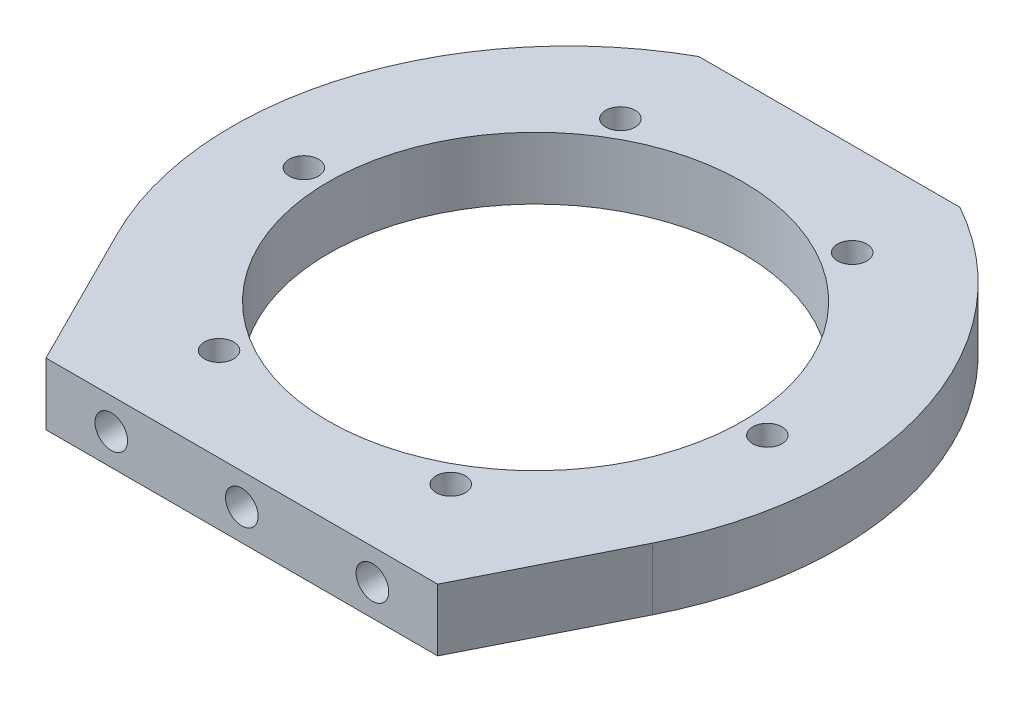
ISO-10303-21;
HEADER;
FILE_DESCRIPTION(('STEP AP214'),'2;1');
FILE_NAME('part.step','',(''),(''),'','','');
FILE_SCHEMA(('AUTOMOTIVE_DESIGN { 1 0 10303 214 1 1 1 1 }'));
ENDSEC;
DATA;
#1=APPLICATION_CONTEXT('core data for automotive mechanical design processes');
#2=APPLICATION_PROTOCOL_DEFINITION('international standard','automotive_design',2000,#1);
#3=PRODUCT_CONTEXT('',#1,'mechanical');
#4=PRODUCT('Part','Part','',(#3));
#5=PRODUCT_RELATED_PRODUCT_CATEGORY('part','',(#4));
#6=PRODUCT_DEFINITION_FORMATION('','',#4);
#7=PRODUCT_DEFINITION_CONTEXT('part definition',#1,'design');
#8=PRODUCT_DEFINITION('design','',#6,#7);
#9=PRODUCT_DEFINITION_SHAPE('','',#8);
#10=(LENGTH_UNIT() NAMED_UNIT(*) SI_UNIT(.MILLI.,.METRE.));
#11=(NAMED_UNIT(*) PLANE_ANGLE_UNIT() SI_UNIT($,.RADIAN.));
#12=(NAMED_UNIT(*) SI_UNIT($,.STERADIAN.) SOLID_ANGLE_UNIT());
#13=UNCERTAINTY_MEASURE_WITH_UNIT(LENGTH_MEASURE(1.E-05),#10,'distance_accuracy_value','');
#14=(GEOMETRIC_REPRESENTATION_CONTEXT(3) GLOBAL_UNCERTAINTY_ASSIGNED_CONTEXT((#13)) GLOBAL_UNIT_ASSIGNED_CONTEXT((#10,
#11,#12)) REPRESENTATION_CONTEXT('',''));
#15=CARTESIAN_POINT('',(0.,0.,0.));
#16=DIRECTION('',(0.,0.,1.));
#17=DIRECTION('',(1.,0.,0.));
#18=AXIS2_PLACEMENT_3D('',#15,#16,#17);
#19=CARTESIAN_POINT('',(-40.9977972178871,4.7625,23.1128243860878));
#20=DIRECTION('',(0.893540202746201,0.,-0.448983191307066));
#21=DIRECTION('',(-0.448983191307066,0.,-0.893540202746202));
#22=AXIS2_PLACEMENT_3D('',#19,#20,#21);
#23=PLANE('',#22);
#24=DIRECTION('',(0.448983191307066,0.,0.893540202746201));
#25=VECTOR('',#24,1.);
#26=CARTESIAN_POINT('',(-40.9977972178871,-4.7625,23.1128243860878));
#27=LINE('',#26,#25);
#28=CARTESIAN_POINT('',(-40.9977972178872,-4.7625,23.1128243860878));
#29=VERTEX_POINT('',#28);
#30=CARTESIAN_POINT('',(-30.,-4.7625,45.));
#31=VERTEX_POINT('',#30);
#32=EDGE_CURVE('E116',#29,#31,#27,.T.);
#33=ORIENTED_EDGE('',*,*,#32,.T.);
#34=DIRECTION('',(0.,-1.,0.));
#35=VECTOR('',#34,1.);
#36=CARTESIAN_POINT('',(-30.,4.7625,45.));
#37=LINE('',#36,#35);
#38=CARTESIAN_POINT('',(-30.,4.7625,45.));
#39=VERTEX_POINT('',#38);
#40=EDGE_CURVE('E11',#39,#31,#37,.T.);
#41=ORIENTED_EDGE('',*,*,#40,.F.);
#42=DIRECTION('',(0.448983191307066,0.,0.893540202746201));
#43=VECTOR('',#42,1.);
#44=CARTESIAN_POINT('',(-40.9977972178871,4.7625,23.1128243860878));
#45=LINE('',#44,#43);
#46=CARTESIAN_POINT('',(-40.9977972178872,4.7625,23.1128243860878));
#47=VERTEX_POINT('',#46);
#48=EDGE_CURVE('E127',#47,#39,#45,.T.);
#49=ORIENTED_EDGE('',*,*,#48,.F.);
#50=DIRECTION('',(0.,-1.,0.));
#51=VECTOR('',#50,1.);
#52=CARTESIAN_POINT('',(-40.9977972178872,4.7625,23.1128243860878));
#53=LINE('',#52,#51);
#54=EDGE_CURVE('E112',#47,#29,#53,.T.);
#55=ORIENTED_EDGE('',*,*,#54,.T.);
#56=EDGE_LOOP('',(#33,#41,#49,#55));
#57=FACE_BOUND('',#56,.T.);
#58=ADVANCED_FACE('F32',(#57),#23,.F.);
#59=CARTESIAN_POINT('',(-30.,4.7625,45.));
#60=DIRECTION('',(0.,0.,-1.));
#61=DIRECTION('',(-1.,0.,0.));
#62=AXIS2_PLACEMENT_3D('',#59,#60,#61);
#63=PLANE('',#62);
#64=CARTESIAN_POINT('',(-20.,0.,45.));
#65=DIRECTION('',(0.,0.,1.));
#66=DIRECTION('',(1.,0.,0.));
#67=AXIS2_PLACEMENT_3D('',#64,#65,#66);
#68=CIRCLE('',#67,2.5);
#69=CARTESIAN_POINT('',(-17.5,0.,45.));
#70=VERTEX_POINT('',#69);
#71=EDGE_CURVE('E405',#70,#70,#68,.T.);
#72=ORIENTED_EDGE('',*,*,#71,.F.);
#73=EDGE_LOOP('',(#72));
#74=FACE_BOUND('',#73,.T.);
#75=CARTESIAN_POINT('',(20.,0.,45.));
#76=DIRECTION('',(0.,0.,1.));
#77=DIRECTION('',(-1.,0.,0.));
#78=AXIS2_PLACEMENT_3D('',#75,#76,#77);
#79=CIRCLE('',#78,2.5);
#80=CARTESIAN_POINT('',(17.5,0.,45.));
#81=VERTEX_POINT('',#80);
#82=EDGE_CURVE('E399',#81,#81,#79,.T.);
#83=ORIENTED_EDGE('',*,*,#82,.F.);
#84=EDGE_LOOP('',(#83));
#85=FACE_BOUND('',#84,.T.);
#86=CARTESIAN_POINT('',(0.,0.,45.));
#87=DIRECTION('',(0.,0.,1.));
#88=DIRECTION('',(1.,0.,0.));
#89=AXIS2_PLACEMENT_3D('',#86,#87,#88);
#90=CIRCLE('',#89,2.5);
#91=CARTESIAN_POINT('',(2.5,0.,45.));
#92=VERTEX_POINT('',#91);
#93=EDGE_CURVE('E393',#92,#92,#90,.T.);
#94=ORIENTED_EDGE('',*,*,#93,.F.);
#95=EDGE_LOOP('',(#94));
#96=FACE_BOUND('',#95,.T.);
#97=DIRECTION('',(1.,0.,0.));
#98=VECTOR('',#97,1.);
#99=CARTESIAN_POINT('',(-30.,-4.7625,45.));
#100=LINE('',#99,#98);
#101=CARTESIAN_POINT('',(30.,-4.7625,45.));
#102=VERTEX_POINT('',#101);
#103=EDGE_CURVE('E119',#31,#102,#100,.T.);
#104=ORIENTED_EDGE('',*,*,#103,.T.);
#105=DIRECTION('',(0.,-1.,0.));
#106=VECTOR('',#105,1.);
#107=CARTESIAN_POINT('',(30.,4.7625,45.));
#108=LINE('',#107,#106);
#109=CARTESIAN_POINT('',(30.,4.7625,45.));
#110=VERTEX_POINT('',#109);
#111=EDGE_CURVE('E40',#110,#102,#108,.T.);
#112=ORIENTED_EDGE('',*,*,#111,.F.);
#113=DIRECTION('',(1.,0.,0.));
#114=VECTOR('',#113,1.);
#115=CARTESIAN_POINT('',(-30.,4.7625,45.));
#116=LINE('',#115,#114);
#117=EDGE_CURVE('E85',#39,#110,#116,.T.);
#118=ORIENTED_EDGE('',*,*,#117,.F.);
#119=ORIENTED_EDGE('',*,*,#40,.T.);
#120=EDGE_LOOP('',(#104,#112,#118,#119));
#121=FACE_BOUND('',#120,.T.);
#122=ADVANCED_FACE('F153',(#74,#85,#96,#121),#63,.F.);
#123=CARTESIAN_POINT('',(40.9977972178871,4.7625,23.1128243860878));
#124=DIRECTION('',(-0.893540202746202,0.,-0.448983191307065));
#125=DIRECTION('',(-0.448983191307065,0.,0.893540202746202));
#126=AXIS2_PLACEMENT_3D('',#123,#124,#125);
#127=PLANE('',#126);
#128=DIRECTION('',(0.448983191307065,0.,-0.893540202746202));
#129=VECTOR('',#128,1.);
#130=CARTESIAN_POINT('',(40.9977972178871,-4.7625,23.1128243860878));
#131=LINE('',#130,#129);
#132=CARTESIAN_POINT('',(40.9977972178871,-4.7625,23.1128243860878));
#133=VERTEX_POINT('',#132);
#134=EDGE_CURVE('E122',#102,#133,#131,.T.);
#135=ORIENTED_EDGE('',*,*,#134,.T.);
#136=DIRECTION('',(0.,-1.,0.));
#137=VECTOR('',#136,1.);
#138=CARTESIAN_POINT('',(40.9977972178871,4.7625,23.1128243860878));
#139=LINE('',#138,#137);
#140=CARTESIAN_POINT('',(40.9977972178871,4.7625,23.1128243860878));
#141=VERTEX_POINT('',#140);
#142=EDGE_CURVE('E107',#141,#133,#139,.T.);
#143=ORIENTED_EDGE('',*,*,#142,.F.);
#144=DIRECTION('',(0.448983191307065,0.,-0.893540202746202));
#145=VECTOR('',#144,1.);
#146=CARTESIAN_POINT('',(40.9977972178871,4.7625,23.1128243860878));
#147=LINE('',#146,#145);
#148=EDGE_CURVE('E98',#110,#141,#147,.T.);
#149=ORIENTED_EDGE('',*,*,#148,.F.);
#150=ORIENTED_EDGE('',*,*,#111,.T.);
#151=EDGE_LOOP('',(#135,#143,#149,#150));
#152=FACE_BOUND('',#151,.T.);
#153=ADVANCED_FACE('F133',(#152),#127,.F.);
#154=CARTESIAN_POINT('',(-5.,4.7625,0.));
#155=DIRECTION('',(0.,-1.,0.));
#156=DIRECTION('',(0.,0.,-1.));
#157=AXIS2_PLACEMENT_3D('',#154,#155,#156);
#158=CYLINDRICAL_SURFACE('',#157,51.478150704935);
#159=CARTESIAN_POINT('',(-5.,-4.7625,0.));
#160=DIRECTION('',(0.,1.,0.));
#161=DIRECTION('',(0.,0.,-1.));
#162=AXIS2_PLACEMENT_3D('',#159,#160,#161);
#163=CIRCLE('',#162,51.478150704935);
#164=CARTESIAN_POINT('',(20.,-4.7625,-45.));
#165=VERTEX_POINT('',#164);
#166=EDGE_CURVE('E106',#133,#165,#163,.T.);
#167=ORIENTED_EDGE('',*,*,#166,.T.);
#168=DIRECTION('',(0.,-1.,0.));
#169=VECTOR('',#168,1.);
#170=CARTESIAN_POINT('',(20.,4.7625,-45.));
#171=LINE('',#170,#169);
#172=CARTESIAN_POINT('',(20.,4.7625,-45.));
#173=VERTEX_POINT('',#172);
#174=EDGE_CURVE('E103',#173,#165,#171,.T.);
#175=ORIENTED_EDGE('',*,*,#174,.F.);
#176=CARTESIAN_POINT('',(-5.,4.7625,0.));
#177=DIRECTION('',(0.,1.,0.));
#178=DIRECTION('',(0.,0.,-1.));
#179=AXIS2_PLACEMENT_3D('',#176,#177,#178);
#180=CIRCLE('',#179,51.478150704935);
#181=EDGE_CURVE('E92',#141,#173,#180,.T.);
#182=ORIENTED_EDGE('',*,*,#181,.F.);
#183=ORIENTED_EDGE('',*,*,#142,.T.);
#184=EDGE_LOOP('',(#167,#175,#182,#183));
#185=FACE_BOUND('',#184,.T.);
#186=ADVANCED_FACE('F104',(#185),#158,.T.);
#187=CARTESIAN_POINT('',(-20.,4.7625,-45.));
#188=DIRECTION('',(0.,0.,1.));
#189=DIRECTION('',(1.,0.,0.));
#190=AXIS2_PLACEMENT_3D('',#187,#188,#189);
#191=PLANE('',#190);
#192=CARTESIAN_POINT('',(12.,0.,-45.));
#193=DIRECTION('',(0.,0.,-1.));
#194=DIRECTION('',(-1.,0.,0.));
#195=AXIS2_PLACEMENT_3D('',#192,#193,#194);
#196=CIRCLE('',#195,2.5);
#197=CARTESIAN_POINT('',(9.50000000000001,0.,-45.));
#198=VERTEX_POINT('',#197);
#199=EDGE_CURVE('E388',#198,#198,#196,.T.);
#200=ORIENTED_EDGE('',*,*,#199,.F.);
#201=EDGE_LOOP('',(#200));
#202=FACE_BOUND('',#201,.T.);
#203=CARTESIAN_POINT('',(-12.,0.,-45.));
#204=DIRECTION('',(0.,0.,-1.));
#205=DIRECTION('',(1.,0.,0.));
#206=AXIS2_PLACEMENT_3D('',#203,#204,#205);
#207=CIRCLE('',#206,2.5);
#208=CARTESIAN_POINT('',(-9.49999999999999,0.,-45.));
#209=VERTEX_POINT('',#208);
#210=EDGE_CURVE('E381',#209,#209,#207,.T.);
#211=ORIENTED_EDGE('',*,*,#210,.F.);
#212=EDGE_LOOP('',(#211));
#213=FACE_BOUND('',#212,.T.);
#214=DIRECTION('',(-1.,0.,0.));
#215=VECTOR('',#214,1.);
#216=CARTESIAN_POINT('',(-20.,-4.7625,-45.));
#217=LINE('',#216,#215);
#218=CARTESIAN_POINT('',(-20.,-4.7625,-45.));
#219=VERTEX_POINT('',#218);
#220=EDGE_CURVE('E71',#165,#219,#217,.T.);
#221=ORIENTED_EDGE('',*,*,#220,.T.);
#222=DIRECTION('',(0.,-1.,0.));
#223=VECTOR('',#222,1.);
#224=CARTESIAN_POINT('',(-20.,4.7625,-45.));
#225=LINE('',#224,#223);
#226=CARTESIAN_POINT('',(-20.,4.7625,-45.));
#227=VERTEX_POINT('',#226);
#228=EDGE_CURVE('E108',#227,#219,#225,.T.);
#229=ORIENTED_EDGE('',*,*,#228,.F.);
#230=DIRECTION('',(-1.,0.,0.));
#231=VECTOR('',#230,1.);
#232=CARTESIAN_POINT('',(-20.,4.7625,-45.));
#233=LINE('',#232,#231);
#234=EDGE_CURVE('E96',#173,#227,#233,.T.);
#235=ORIENTED_EDGE('',*,*,#234,.F.);
#236=ORIENTED_EDGE('',*,*,#174,.T.);
#237=EDGE_LOOP('',(#221,#229,#235,#236));
#238=FACE_BOUND('',#237,.T.);
#239=ADVANCED_FACE('F110',(#202,#213,#238),#191,.F.);
#240=CARTESIAN_POINT('',(5.,4.7625,0.));
#241=DIRECTION('',(0.,-1.,0.));
#242=DIRECTION('',(0.,0.,-1.));
#243=AXIS2_PLACEMENT_3D('',#240,#241,#242);
#244=CYLINDRICAL_SURFACE('',#243,51.478150704935);
#245=CARTESIAN_POINT('',(5.,-4.7625,0.));
#246=DIRECTION('',(0.,1.,0.));
#247=DIRECTION('',(0.,0.,1.));
#248=AXIS2_PLACEMENT_3D('',#245,#246,#247);
#249=CIRCLE('',#248,51.478150704935);
#250=EDGE_CURVE('E77',#219,#29,#249,.T.);
#251=ORIENTED_EDGE('',*,*,#250,.T.);
#252=ORIENTED_EDGE('',*,*,#54,.F.);
#253=CARTESIAN_POINT('',(5.,4.7625,0.));
#254=DIRECTION('',(0.,1.,0.));
#255=DIRECTION('',(0.,0.,1.));
#256=AXIS2_PLACEMENT_3D('',#253,#254,#255);
#257=CIRCLE('',#256,51.478150704935);
#258=EDGE_CURVE('E48',#227,#47,#257,.T.);
#259=ORIENTED_EDGE('',*,*,#258,.F.);
#260=ORIENTED_EDGE('',*,*,#228,.T.);
#261=EDGE_LOOP('',(#251,#252,#259,#260));
#262=FACE_BOUND('',#261,.T.);
#263=ADVANCED_FACE('F140',(#262),#244,.T.);
#264=CARTESIAN_POINT('',(-5.,4.7625,0.));
#265=DIRECTION('',(0.,-1.,0.));
#266=DIRECTION('',(0.,0.,-1.));
#267=AXIS2_PLACEMENT_3D('',#264,#265,#266);
#268=PLANE('',#267);
#269=CARTESIAN_POINT('',(-17.7499999999993,4.7625,-30.7439018343462));
#270=DIRECTION('',(0.,1.,0.));
#271=DIRECTION('',(0.,0.,1.));
#272=AXIS2_PLACEMENT_3D('',#269,#270,#271);
#273=CIRCLE('',#272,2.25);
#274=CARTESIAN_POINT('',(-17.7499999999993,4.7625,-28.4939018343462));
#275=VERTEX_POINT('',#274);
#276=EDGE_CURVE('E362',#275,#275,#273,.T.);
#277=ORIENTED_EDGE('',*,*,#276,.F.);
#278=EDGE_LOOP('',(#277));
#279=FACE_BOUND('',#278,.T.);
#280=CARTESIAN_POINT('',(-35.4999999999977,4.7625,1.41206490944512E-12));
#281=DIRECTION('',(0.,1.,0.));
#282=DIRECTION('',(0.,0.,1.));
#283=AXIS2_PLACEMENT_3D('',#280,#281,#282);
#284=CIRCLE('',#283,2.25);
#285=CARTESIAN_POINT('',(-35.4999999999977,4.7625,2.25000000000141));
#286=VERTEX_POINT('',#285);
#287=EDGE_CURVE('E361',#286,#286,#284,.T.);
#288=ORIENTED_EDGE('',*,*,#287,.F.);
#289=EDGE_LOOP('',(#288));
#290=FACE_BOUND('',#289,.T.);
#291=CARTESIAN_POINT('',(-17.7499999999969,4.7625,30.7439018343476));
#292=DIRECTION('',(0.,1.,0.));
#293=DIRECTION('',(0.,0.,1.));
#294=AXIS2_PLACEMENT_3D('',#291,#292,#293);
#295=CIRCLE('',#294,2.25);
#296=CARTESIAN_POINT('',(-17.7499999999969,4.7625,32.9939018343476));
#297=VERTEX_POINT('',#296);
#298=EDGE_CURVE('E367',#297,#297,#295,.T.);
#299=ORIENTED_EDGE('',*,*,#298,.F.);
#300=EDGE_LOOP('',(#299));
#301=FACE_BOUND('',#300,.T.);
#302=CARTESIAN_POINT('',(17.7500000000023,4.7625,30.7439018343462));
#303=DIRECTION('',(0.,1.,0.));
#304=DIRECTION('',(0.,0.,1.));
#305=AXIS2_PLACEMENT_3D('',#302,#303,#304);
#306=CIRCLE('',#305,2.25);
#307=CARTESIAN_POINT('',(17.7500000000023,4.7625,32.9939018343462));
#308=VERTEX_POINT('',#307);
#309=EDGE_CURVE('E371',#308,#308,#306,.T.);
#310=ORIENTED_EDGE('',*,*,#309,.F.);
#311=EDGE_LOOP('',(#310));
#312=FACE_BOUND('',#311,.T.);
#313=CARTESIAN_POINT('',(35.5000000000007,4.7625,-1.40859546249317E-12));
#314=DIRECTION('',(0.,1.,0.));
#315=DIRECTION('',(0.,0.,1.));
#316=AXIS2_PLACEMENT_3D('',#313,#314,#315);
#317=CIRCLE('',#316,2.25);
#318=CARTESIAN_POINT('',(35.5000000000007,4.7625,2.24999999999859));
#319=VERTEX_POINT('',#318);
#320=EDGE_CURVE('E375',#319,#319,#317,.T.);
#321=ORIENTED_EDGE('',*,*,#320,.F.);
#322=EDGE_LOOP('',(#321));
#323=FACE_BOUND('',#322,.T.);
#324=CARTESIAN_POINT('',(17.7499999999999,4.7625,-30.7439018343476));
#325=DIRECTION('',(0.,1.,0.));
#326=DIRECTION('',(0.,0.,1.));
#327=AXIS2_PLACEMENT_3D('',#324,#325,#326);
#328=CIRCLE('',#327,2.25);
#329=CARTESIAN_POINT('',(17.7499999999999,4.7625,-28.4939018343476));
#330=VERTEX_POINT('',#329);
#331=EDGE_CURVE('E357',#330,#330,#328,.T.);
#332=ORIENTED_EDGE('',*,*,#331,.F.);
#333=EDGE_LOOP('',(#332));
#334=FACE_BOUND('',#333,.T.);
#335=CARTESIAN_POINT('',(0.,4.7625,0.));
#336=DIRECTION('',(0.,1.,0.));
#337=DIRECTION('',(0.,0.,1.));
#338=AXIS2_PLACEMENT_3D('',#335,#336,#337);
#339=CIRCLE('',#338,31.75);
#340=CARTESIAN_POINT('',(0.,4.7625,31.75));
#341=VERTEX_POINT('',#340);
#342=EDGE_CURVE('E349',#341,#341,#339,.T.);
#343=ORIENTED_EDGE('',*,*,#342,.F.);
#344=EDGE_LOOP('',(#343));
#345=FACE_BOUND('',#344,.T.);
#346=ORIENTED_EDGE('',*,*,#48,.T.);
#347=ORIENTED_EDGE('',*,*,#117,.T.);
#348=ORIENTED_EDGE('',*,*,#148,.T.);
#349=ORIENTED_EDGE('',*,*,#181,.T.);
#350=ORIENTED_EDGE('',*,*,#234,.T.);
#351=ORIENTED_EDGE('',*,*,#258,.T.);
#352=EDGE_LOOP('',(#346,#347,#348,#349,#350,#351));
#353=FACE_BOUND('',#352,.T.);
#354=ADVANCED_FACE('F94',(#279,#290,#301,#312,#323,#334,#345,#353),#268,.F.);
#355=CARTESIAN_POINT('',(-5.,-4.7625,0.));
#356=DIRECTION('',(0.,-1.,0.));
#357=DIRECTION('',(0.,0.,-1.));
#358=AXIS2_PLACEMENT_3D('',#355,#356,#357);
#359=PLANE('',#358);
#360=CARTESIAN_POINT('',(-17.7499999999993,-4.7625,-30.7439018343462));
#361=DIRECTION('',(0.,-1.,0.));
#362=DIRECTION('',(0.,0.,-1.));
#363=AXIS2_PLACEMENT_3D('',#360,#361,#362);
#364=CIRCLE('',#363,2.25);
#365=CARTESIAN_POINT('',(-17.7499999999993,-4.7625,-32.9939018343462));
#366=VERTEX_POINT('',#365);
#367=EDGE_CURVE('E325',#366,#366,#364,.F.);
#368=ORIENTED_EDGE('',*,*,#367,.T.);
#369=EDGE_LOOP('',(#368));
#370=FACE_BOUND('',#369,.T.);
#371=CARTESIAN_POINT('',(-35.4999999999977,-4.7625,1.41206490944512E-12));
#372=DIRECTION('',(0.,-1.,0.));
#373=DIRECTION('',(0.,0.,-1.));
#374=AXIS2_PLACEMENT_3D('',#371,#372,#373);
#375=CIRCLE('',#374,2.25);
#376=CARTESIAN_POINT('',(-35.4999999999977,-4.7625,-2.24999999999859));
#377=VERTEX_POINT('',#376);
#378=EDGE_CURVE('E329',#377,#377,#375,.F.);
#379=ORIENTED_EDGE('',*,*,#378,.T.);
#380=EDGE_LOOP('',(#379));
#381=FACE_BOUND('',#380,.T.);
#382=CARTESIAN_POINT('',(-17.7499999999969,-4.7625,30.7439018343476));
#383=DIRECTION('',(0.,-1.,0.));
#384=DIRECTION('',(0.,0.,-1.));
#385=AXIS2_PLACEMENT_3D('',#382,#383,#384);
#386=CIRCLE('',#385,2.25);
#387=CARTESIAN_POINT('',(-17.7499999999969,-4.7625,28.4939018343476));
#388=VERTEX_POINT('',#387);
#389=EDGE_CURVE('E333',#388,#388,#386,.F.);
#390=ORIENTED_EDGE('',*,*,#389,.T.);
#391=EDGE_LOOP('',(#390));
#392=FACE_BOUND('',#391,.T.);
#393=CARTESIAN_POINT('',(17.7500000000023,-4.7625,30.7439018343462));
#394=DIRECTION('',(0.,-1.,0.));
#395=DIRECTION('',(0.,0.,-1.));
#396=AXIS2_PLACEMENT_3D('',#393,#394,#395);
#397=CIRCLE('',#396,2.25);
#398=CARTESIAN_POINT('',(17.7500000000023,-4.7625,28.4939018343462));
#399=VERTEX_POINT('',#398);
#400=EDGE_CURVE('E337',#399,#399,#397,.F.);
#401=ORIENTED_EDGE('',*,*,#400,.T.);
#402=EDGE_LOOP('',(#401));
#403=FACE_BOUND('',#402,.T.);
#404=CARTESIAN_POINT('',(35.5000000000007,-4.7625,-1.40859546249317E-12));
#405=DIRECTION('',(0.,-1.,0.));
#406=DIRECTION('',(0.,0.,-1.));
#407=AXIS2_PLACEMENT_3D('',#404,#405,#406);
#408=CIRCLE('',#407,2.25);
#409=CARTESIAN_POINT('',(35.5000000000007,-4.7625,-2.25000000000141));
#410=VERTEX_POINT('',#409);
#411=EDGE_CURVE('E341',#410,#410,#408,.F.);
#412=ORIENTED_EDGE('',*,*,#411,.T.);
#413=EDGE_LOOP('',(#412));
#414=FACE_BOUND('',#413,.T.);
#415=CARTESIAN_POINT('',(17.7499999999999,-4.7625,-30.7439018343476));
#416=DIRECTION('',(0.,-1.,0.));
#417=DIRECTION('',(0.,0.,-1.));
#418=AXIS2_PLACEMENT_3D('',#415,#416,#417);
#419=CIRCLE('',#418,2.25);
#420=CARTESIAN_POINT('',(17.7499999999999,-4.7625,-32.9939018343476));
#421=VERTEX_POINT('',#420);
#422=EDGE_CURVE('E345',#421,#421,#419,.F.);
#423=ORIENTED_EDGE('',*,*,#422,.T.);
#424=EDGE_LOOP('',(#423));
#425=FACE_BOUND('',#424,.T.);
#426=CARTESIAN_POINT('',(0.,-4.7625,0.));
#427=DIRECTION('',(0.,-1.,0.));
#428=DIRECTION('',(0.,0.,-1.));
#429=AXIS2_PLACEMENT_3D('',#426,#427,#428);
#430=CIRCLE('',#429,31.75);
#431=CARTESIAN_POINT('',(0.,-4.7625,-31.75));
#432=VERTEX_POINT('',#431);
#433=EDGE_CURVE('E120',#432,#432,#430,.F.);
#434=ORIENTED_EDGE('',*,*,#433,.T.);
#435=EDGE_LOOP('',(#434));
#436=FACE_BOUND('',#435,.T.);
#437=ORIENTED_EDGE('',*,*,#32,.F.);
#438=ORIENTED_EDGE('',*,*,#250,.F.);
#439=ORIENTED_EDGE('',*,*,#220,.F.);
#440=ORIENTED_EDGE('',*,*,#166,.F.);
#441=ORIENTED_EDGE('',*,*,#134,.F.);
#442=ORIENTED_EDGE('',*,*,#103,.F.);
#443=EDGE_LOOP('',(#437,#438,#439,#440,#441,#442));
#444=FACE_BOUND('',#443,.T.);
#445=ADVANCED_FACE('F136',(#370,#381,#392,#403,#414,#425,#436,#444),#359,.T.);
#446=CARTESIAN_POINT('',(0.,-94.5650612106915,0.));
#447=DIRECTION('',(0.,1.,0.));
#448=DIRECTION('',(0.,0.,1.));
#449=AXIS2_PLACEMENT_3D('',#446,#447,#448);
#450=CYLINDRICAL_SURFACE('',#449,31.75);
#451=ORIENTED_EDGE('',*,*,#342,.T.);
#452=EDGE_LOOP('',(#451));
#453=FACE_BOUND('',#452,.T.);
#454=ORIENTED_EDGE('',*,*,#433,.F.);
#455=EDGE_LOOP('',(#454));
#456=FACE_BOUND('',#455,.T.);
#457=ADVANCED_FACE('F314',(#453,#456),#450,.F.);
#458=CARTESIAN_POINT('',(17.7499999999999,-11.1264610306789,-30.7439018343476));
#459=DIRECTION('',(0.,1.,0.));
#460=DIRECTION('',(0.,0.,1.));
#461=AXIS2_PLACEMENT_3D('',#458,#459,#460);
#462=CYLINDRICAL_SURFACE('',#461,2.25);
#463=ORIENTED_EDGE('',*,*,#331,.T.);
#464=EDGE_LOOP('',(#463));
#465=FACE_BOUND('',#464,.T.);
#466=ORIENTED_EDGE('',*,*,#422,.F.);
#467=EDGE_LOOP('',(#466));
#468=FACE_BOUND('',#467,.T.);
#469=ADVANCED_FACE('F297',(#465,#468),#462,.F.);
#470=CARTESIAN_POINT('',(35.5000000000007,-11.1264610306789,-1.40859546249317E-12));
#471=DIRECTION('',(0.,1.,0.));
#472=DIRECTION('',(0.,0.,1.));
#473=AXIS2_PLACEMENT_3D('',#470,#471,#472);
#474=CYLINDRICAL_SURFACE('',#473,2.25);
#475=ORIENTED_EDGE('',*,*,#320,.T.);
#476=EDGE_LOOP('',(#475));
#477=FACE_BOUND('',#476,.T.);
#478=ORIENTED_EDGE('',*,*,#411,.F.);
#479=EDGE_LOOP('',(#478));
#480=FACE_BOUND('',#479,.T.);
#481=ADVANCED_FACE('F293',(#477,#480),#474,.F.);
#482=CARTESIAN_POINT('',(17.7500000000023,-11.1264610306789,30.7439018343462));
#483=DIRECTION('',(0.,1.,0.));
#484=DIRECTION('',(0.,0.,1.));
#485=AXIS2_PLACEMENT_3D('',#482,#483,#484);
#486=CYLINDRICAL_SURFACE('',#485,2.25);
#487=ORIENTED_EDGE('',*,*,#309,.T.);
#488=EDGE_LOOP('',(#487));
#489=FACE_BOUND('',#488,.T.);
#490=ORIENTED_EDGE('',*,*,#400,.F.);
#491=EDGE_LOOP('',(#490));
#492=FACE_BOUND('',#491,.T.);
#493=ADVANCED_FACE('F296',(#489,#492),#486,.F.);
#494=CARTESIAN_POINT('',(-17.7499999999969,-11.1264610306789,30.7439018343476));
#495=DIRECTION('',(0.,1.,0.));
#496=DIRECTION('',(0.,0.,1.));
#497=AXIS2_PLACEMENT_3D('',#494,#495,#496);
#498=CYLINDRICAL_SURFACE('',#497,2.25);
#499=ORIENTED_EDGE('',*,*,#298,.T.);
#500=EDGE_LOOP('',(#499));
#501=FACE_BOUND('',#500,.T.);
#502=ORIENTED_EDGE('',*,*,#389,.F.);
#503=EDGE_LOOP('',(#502));
#504=FACE_BOUND('',#503,.T.);
#505=ADVANCED_FACE('F301',(#501,#504),#498,.F.);
#506=CARTESIAN_POINT('',(-35.4999999999977,-11.1264610306789,1.41206490944512E-12));
#507=DIRECTION('',(0.,1.,0.));
#508=DIRECTION('',(0.,0.,1.));
#509=AXIS2_PLACEMENT_3D('',#506,#507,#508);
#510=CYLINDRICAL_SURFACE('',#509,2.25);
#511=ORIENTED_EDGE('',*,*,#287,.T.);
#512=EDGE_LOOP('',(#511));
#513=FACE_BOUND('',#512,.T.);
#514=ORIENTED_EDGE('',*,*,#378,.F.);
#515=EDGE_LOOP('',(#514));
#516=FACE_BOUND('',#515,.T.);
#517=ADVANCED_FACE('F305',(#513,#516),#510,.F.);
#518=CARTESIAN_POINT('',(-17.7499999999993,-11.1264610306789,-30.7439018343462));
#519=DIRECTION('',(0.,1.,0.));
#520=DIRECTION('',(0.,0.,1.));
#521=AXIS2_PLACEMENT_3D('',#518,#519,#520);
#522=CYLINDRICAL_SURFACE('',#521,2.25);
#523=ORIENTED_EDGE('',*,*,#276,.T.);
#524=EDGE_LOOP('',(#523));
#525=FACE_BOUND('',#524,.T.);
#526=ORIENTED_EDGE('',*,*,#367,.F.);
#527=EDGE_LOOP('',(#526));
#528=FACE_BOUND('',#527,.T.);
#529=ADVANCED_FACE('F181',(#525,#528),#522,.F.);
#530=CARTESIAN_POINT('',(-12.,0.,-37.));
#531=DIRECTION('',(0.,0.,-1.));
#532=DIRECTION('',(-1.,0.,0.));
#533=AXIS2_PLACEMENT_3D('',#530,#531,#532);
#534=CYLINDRICAL_SURFACE('',#533,2.5);
#535=CARTESIAN_POINT('',(-12.,0.,-37.));
#536=DIRECTION('',(0.,0.,-1.));
#537=DIRECTION('',(1.,0.,0.));
#538=AXIS2_PLACEMENT_3D('',#535,#536,#537);
#539=CIRCLE('',#538,2.5);
#540=CARTESIAN_POINT('',(-9.49999999999999,0.,-37.));
#541=VERTEX_POINT('',#540);
#542=EDGE_CURVE('E384',#541,#541,#539,.T.);
#543=ORIENTED_EDGE('',*,*,#542,.F.);
#544=EDGE_LOOP('',(#543));
#545=FACE_BOUND('',#544,.T.);
#546=ORIENTED_EDGE('',*,*,#210,.T.);
#547=EDGE_LOOP('',(#546));
#548=FACE_BOUND('',#547,.T.);
#549=ADVANCED_FACE('F186',(#545,#548),#534,.F.);
#550=CARTESIAN_POINT('',(-12.,0.,-37.));
#551=DIRECTION('',(0.,0.,1.));
#552=DIRECTION('',(1.,0.,0.));
#553=AXIS2_PLACEMENT_3D('',#550,#551,#552);
#554=PLANE('',#553);
#555=ORIENTED_EDGE('',*,*,#542,.T.);
#556=EDGE_LOOP('',(#555));
#557=FACE_BOUND('',#556,.T.);
#558=ADVANCED_FACE('F191',(#557),#554,.F.);
#559=CARTESIAN_POINT('',(12.,0.,-37.));
#560=DIRECTION('',(0.,0.,-1.));
#561=DIRECTION('',(-1.,0.,0.));
#562=AXIS2_PLACEMENT_3D('',#559,#560,#561);
#563=CYLINDRICAL_SURFACE('',#562,2.5);
#564=CARTESIAN_POINT('',(12.,0.,-37.));
#565=DIRECTION('',(0.,0.,-1.));
#566=DIRECTION('',(-1.,0.,0.));
#567=AXIS2_PLACEMENT_3D('',#564,#565,#566);
#568=CIRCLE('',#567,2.5);
#569=CARTESIAN_POINT('',(9.50000000000001,0.,-37.));
#570=VERTEX_POINT('',#569);
#571=EDGE_CURVE('E365',#570,#570,#568,.T.);
#572=ORIENTED_EDGE('',*,*,#571,.F.);
#573=EDGE_LOOP('',(#572));
#574=FACE_BOUND('',#573,.T.);
#575=ORIENTED_EDGE('',*,*,#199,.T.);
#576=EDGE_LOOP('',(#575));
#577=FACE_BOUND('',#576,.T.);
#578=ADVANCED_FACE('F201',(#574,#577),#563,.F.);
#579=CARTESIAN_POINT('',(12.,0.,-37.));
#580=DIRECTION('',(0.,0.,-1.));
#581=DIRECTION('',(-1.,0.,0.));
#582=AXIS2_PLACEMENT_3D('',#579,#580,#581);
#583=PLANE('',#582);
#584=ORIENTED_EDGE('',*,*,#571,.T.);
#585=EDGE_LOOP('',(#584));
#586=FACE_BOUND('',#585,.T.);
#587=ADVANCED_FACE('F211',(#586),#583,.T.);
#588=CARTESIAN_POINT('',(0.,0.,37.));
#589=DIRECTION('',(0.,0.,1.));
#590=DIRECTION('',(1.,0.,0.));
#591=AXIS2_PLACEMENT_3D('',#588,#589,#590);
#592=CYLINDRICAL_SURFACE('',#591,2.5);
#593=CARTESIAN_POINT('',(0.,0.,37.));
#594=DIRECTION('',(0.,0.,1.));
#595=DIRECTION('',(1.,0.,0.));
#596=AXIS2_PLACEMENT_3D('',#593,#594,#595);
#597=CIRCLE('',#596,2.5);
#598=CARTESIAN_POINT('',(2.5,0.,37.));
#599=VERTEX_POINT('',#598);
#600=EDGE_CURVE('E396',#599,#599,#597,.T.);
#601=ORIENTED_EDGE('',*,*,#600,.F.);
#602=EDGE_LOOP('',(#601));
#603=FACE_BOUND('',#602,.T.);
#604=ORIENTED_EDGE('',*,*,#93,.T.);
#605=EDGE_LOOP('',(#604));
#606=FACE_BOUND('',#605,.T.);
#607=ADVANCED_FACE('F220',(#603,#606),#592,.F.);
#608=CARTESIAN_POINT('',(0.,0.,37.));
#609=DIRECTION('',(0.,0.,1.));
#610=DIRECTION('',(1.,0.,0.));
#611=AXIS2_PLACEMENT_3D('',#608,#609,#610);
#612=PLANE('',#611);
#613=ORIENTED_EDGE('',*,*,#600,.T.);
#614=EDGE_LOOP('',(#613));
#615=FACE_BOUND('',#614,.T.);
#616=ADVANCED_FACE('F237',(#615),#612,.T.);
#617=CARTESIAN_POINT('',(20.,0.,37.));
#618=DIRECTION('',(0.,0.,1.));
#619=DIRECTION('',(1.,0.,0.));
#620=AXIS2_PLACEMENT_3D('',#617,#618,#619);
#621=CYLINDRICAL_SURFACE('',#620,2.5);
#622=CARTESIAN_POINT('',(20.,0.,37.));
#623=DIRECTION('',(0.,0.,1.));
#624=DIRECTION('',(-1.,0.,0.));
#625=AXIS2_PLACEMENT_3D('',#622,#623,#624);
#626=CIRCLE('',#625,2.5);
#627=CARTESIAN_POINT('',(17.5,0.,37.));
#628=VERTEX_POINT('',#627);
#629=EDGE_CURVE('E402',#628,#628,#626,.T.);
#630=ORIENTED_EDGE('',*,*,#629,.F.);
#631=EDGE_LOOP('',(#630));
#632=FACE_BOUND('',#631,.T.);
#633=ORIENTED_EDGE('',*,*,#82,.T.);
#634=EDGE_LOOP('',(#633));
#635=FACE_BOUND('',#634,.T.);
#636=ADVANCED_FACE('F247',(#632,#635),#621,.F.);
#637=CARTESIAN_POINT('',(20.,0.,37.));
#638=DIRECTION('',(0.,0.,-1.));
#639=DIRECTION('',(-1.,0.,0.));
#640=AXIS2_PLACEMENT_3D('',#637,#638,#639);
#641=PLANE('',#640);
#642=ORIENTED_EDGE('',*,*,#629,.T.);
#643=EDGE_LOOP('',(#642));
#644=FACE_BOUND('',#643,.T.);
#645=ADVANCED_FACE('F257',(#644),#641,.F.);
#646=CARTESIAN_POINT('',(-20.,0.,37.));
#647=DIRECTION('',(0.,0.,1.));
#648=DIRECTION('',(1.,0.,0.));
#649=AXIS2_PLACEMENT_3D('',#646,#647,#648);
#650=CYLINDRICAL_SURFACE('',#649,2.5);
#651=CARTESIAN_POINT('',(-20.,0.,37.));
#652=DIRECTION('',(0.,0.,1.));
#653=DIRECTION('',(1.,0.,0.));
#654=AXIS2_PLACEMENT_3D('',#651,#652,#653);
#655=CIRCLE('',#654,2.5);
#656=CARTESIAN_POINT('',(-17.5,0.,37.));
#657=VERTEX_POINT('',#656);
#658=EDGE_CURVE('E385',#657,#657,#655,.T.);
#659=ORIENTED_EDGE('',*,*,#658,.F.);
#660=EDGE_LOOP('',(#659));
#661=FACE_BOUND('',#660,.T.);
#662=ORIENTED_EDGE('',*,*,#71,.T.);
#663=EDGE_LOOP('',(#662));
#664=FACE_BOUND('',#663,.T.);
#665=ADVANCED_FACE('F267',(#661,#664),#650,.F.);
#666=CARTESIAN_POINT('',(-20.,0.,37.));
#667=DIRECTION('',(0.,0.,1.));
#668=DIRECTION('',(1.,0.,0.));
#669=AXIS2_PLACEMENT_3D('',#666,#667,#668);
#670=PLANE('',#669);
#671=ORIENTED_EDGE('',*,*,#658,.T.);
#672=EDGE_LOOP('',(#671));
#673=FACE_BOUND('',#672,.T.);
#674=ADVANCED_FACE('F277',(#673),#670,.T.);
#675=CLOSED_SHELL('',(#58,#122,#153,#186,#239,#263,#354,#445,#457,#469,#481,#493,#505,#517,#529,
#549,#558,#578,#587,#607,#616,#636,#645,#665,#674));
#676=MANIFOLD_SOLID_BREP('B2',#675);
#677=ADVANCED_BREP_SHAPE_REPRESENTATION('',(#18,#676),#14);
#678=SHAPE_DEFINITION_REPRESENTATION(#9,#677);
ENDSEC;
END-ISO-10303-21;
